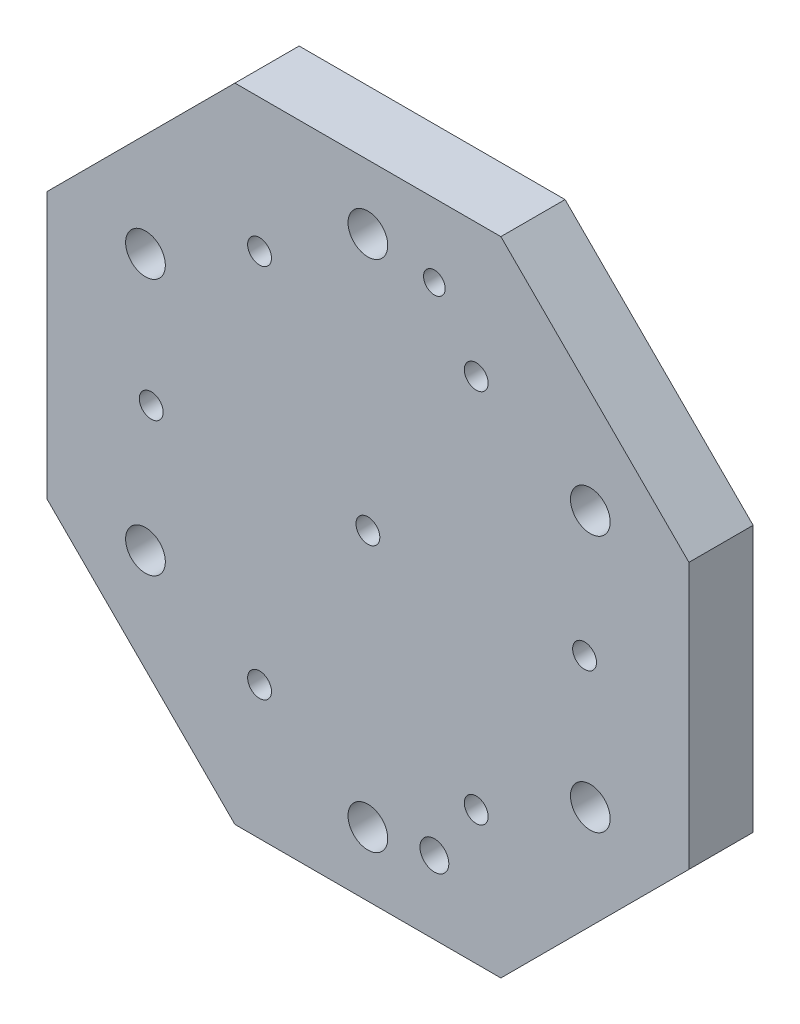
ISO-10303-21;
HEADER;
FILE_DESCRIPTION(('STEP AP214'),'2;1');
FILE_NAME('part.step','',(''),(''),'','','');
FILE_SCHEMA(('AUTOMOTIVE_DESIGN { 1 0 10303 214 1 1 1 1 }'));
ENDSEC;
DATA;
#1=APPLICATION_CONTEXT('core data for automotive mechanical design processes');
#2=APPLICATION_PROTOCOL_DEFINITION('international standard','automotive_design',2000,#1);
#3=PRODUCT_CONTEXT('',#1,'mechanical');
#4=PRODUCT('Part','Part','',(#3));
#5=PRODUCT_RELATED_PRODUCT_CATEGORY('part','',(#4));
#6=PRODUCT_DEFINITION_FORMATION('','',#4);
#7=PRODUCT_DEFINITION_CONTEXT('part definition',#1,'design');
#8=PRODUCT_DEFINITION('design','',#6,#7);
#9=PRODUCT_DEFINITION_SHAPE('','',#8);
#10=(LENGTH_UNIT() NAMED_UNIT(*) SI_UNIT(.MILLI.,.METRE.));
#11=(NAMED_UNIT(*) PLANE_ANGLE_UNIT() SI_UNIT($,.RADIAN.));
#12=(NAMED_UNIT(*) SI_UNIT($,.STERADIAN.) SOLID_ANGLE_UNIT());
#13=UNCERTAINTY_MEASURE_WITH_UNIT(LENGTH_MEASURE(1.E-05),#10,'distance_accuracy_value','');
#14=(GEOMETRIC_REPRESENTATION_CONTEXT(3) GLOBAL_UNCERTAINTY_ASSIGNED_CONTEXT((#13)) GLOBAL_UNIT_ASSIGNED_CONTEXT((#10,
#11,#12)) REPRESENTATION_CONTEXT('',''));
#15=CARTESIAN_POINT('',(0.,0.,0.));
#16=DIRECTION('',(0.,0.,1.));
#17=DIRECTION('',(1.,0.,0.));
#18=AXIS2_PLACEMENT_3D('',#15,#16,#17);
#19=CARTESIAN_POINT('',(0.,0.,0.));
#20=DIRECTION('',(0.,0.,1.));
#21=DIRECTION('',(1.,0.,0.));
#22=AXIS2_PLACEMENT_3D('',#19,#20,#21);
#23=PLANE('',#22);
#24=CARTESIAN_POINT('',(0.,0.,0.));
#25=DIRECTION('',(0.,0.,-1.));
#26=DIRECTION('',(-1.,0.,0.));
#27=AXIS2_PLACEMENT_3D('',#24,#25,#26);
#28=CIRCLE('',#27,1.65);
#29=CARTESIAN_POINT('',(-1.65,0.,0.));
#30=VERTEX_POINT('',#29);
#31=EDGE_CURVE('E273',#30,#30,#28,.T.);
#32=ORIENTED_EDGE('',*,*,#31,.T.);
#33=EDGE_LOOP('',(#32));
#34=FACE_BOUND('',#33,.T.);
#35=CARTESIAN_POINT('',(-30.,0.,0.));
#36=DIRECTION('',(0.,0.,-1.));
#37=DIRECTION('',(-1.,0.,0.));
#38=AXIS2_PLACEMENT_3D('',#35,#36,#37);
#39=CIRCLE('',#38,1.65);
#40=CARTESIAN_POINT('',(-31.65,0.,0.));
#41=VERTEX_POINT('',#40);
#42=EDGE_CURVE('E278',#41,#41,#39,.T.);
#43=ORIENTED_EDGE('',*,*,#42,.T.);
#44=EDGE_LOOP('',(#43));
#45=FACE_BOUND('',#44,.T.);
#46=CARTESIAN_POINT('',(15.,-25.9807621135332,0.));
#47=DIRECTION('',(0.,0.,-1.));
#48=DIRECTION('',(-1.,0.,0.));
#49=AXIS2_PLACEMENT_3D('',#46,#47,#48);
#50=CIRCLE('',#49,1.65);
#51=CARTESIAN_POINT('',(13.35,-25.9807621135332,0.));
#52=VERTEX_POINT('',#51);
#53=EDGE_CURVE('E292',#52,#52,#50,.T.);
#54=ORIENTED_EDGE('',*,*,#53,.T.);
#55=EDGE_LOOP('',(#54));
#56=FACE_BOUND('',#55,.T.);
#57=CARTESIAN_POINT('',(15.,25.9807621135332,0.));
#58=DIRECTION('',(0.,0.,-1.));
#59=DIRECTION('',(-1.,0.,0.));
#60=AXIS2_PLACEMENT_3D('',#57,#58,#59);
#61=CIRCLE('',#60,1.65);
#62=CARTESIAN_POINT('',(13.35,25.9807621135332,0.));
#63=VERTEX_POINT('',#62);
#64=EDGE_CURVE('E300',#63,#63,#61,.T.);
#65=ORIENTED_EDGE('',*,*,#64,.T.);
#66=EDGE_LOOP('',(#65));
#67=FACE_BOUND('',#66,.T.);
#68=CARTESIAN_POINT('',(-15.,25.9807621135332,0.));
#69=DIRECTION('',(0.,0.,-1.));
#70=DIRECTION('',(-1.,0.,0.));
#71=AXIS2_PLACEMENT_3D('',#68,#69,#70);
#72=CIRCLE('',#71,1.65);
#73=CARTESIAN_POINT('',(-16.65,25.9807621135332,0.));
#74=VERTEX_POINT('',#73);
#75=EDGE_CURVE('E308',#74,#74,#72,.T.);
#76=ORIENTED_EDGE('',*,*,#75,.T.);
#77=EDGE_LOOP('',(#76));
#78=FACE_BOUND('',#77,.T.);
#79=CARTESIAN_POINT('',(-15.,-25.9807621135332,0.));
#80=DIRECTION('',(0.,0.,-1.));
#81=DIRECTION('',(-1.,0.,0.));
#82=AXIS2_PLACEMENT_3D('',#79,#80,#81);
#83=CIRCLE('',#82,1.65);
#84=CARTESIAN_POINT('',(-16.65,-25.9807621135332,0.));
#85=VERTEX_POINT('',#84);
#86=EDGE_CURVE('E315',#85,#85,#83,.T.);
#87=ORIENTED_EDGE('',*,*,#86,.T.);
#88=EDGE_LOOP('',(#87));
#89=FACE_BOUND('',#88,.T.);
#90=CARTESIAN_POINT('',(30.,0.,0.));
#91=DIRECTION('',(0.,0.,-1.));
#92=DIRECTION('',(-1.,0.,0.));
#93=AXIS2_PLACEMENT_3D('',#90,#91,#92);
#94=CIRCLE('',#93,1.65);
#95=CARTESIAN_POINT('',(28.35,0.,0.));
#96=VERTEX_POINT('',#95);
#97=EDGE_CURVE('E323',#96,#96,#94,.T.);
#98=ORIENTED_EDGE('',*,*,#97,.T.);
#99=EDGE_LOOP('',(#98));
#100=FACE_BOUND('',#99,.T.);
#101=CARTESIAN_POINT('',(30.7958633585751,17.7800000000003,0.));
#102=DIRECTION('',(0.,0.,-1.));
#103=DIRECTION('',(-1.,0.,0.));
#104=AXIS2_PLACEMENT_3D('',#101,#102,#103);
#105=CIRCLE('',#104,2.75);
#106=CARTESIAN_POINT('',(28.045863358575,17.7800000000003,0.));
#107=VERTEX_POINT('',#106);
#108=EDGE_CURVE('E355',#107,#107,#105,.T.);
#109=ORIENTED_EDGE('',*,*,#108,.T.);
#110=EDGE_LOOP('',(#109));
#111=FACE_BOUND('',#110,.T.);
#112=CARTESIAN_POINT('',(30.7958633585748,-17.7799999999998,0.));
#113=DIRECTION('',(0.,0.,-1.));
#114=DIRECTION('',(-1.,0.,0.));
#115=AXIS2_PLACEMENT_3D('',#112,#113,#114);
#116=CIRCLE('',#115,2.75);
#117=CARTESIAN_POINT('',(28.0458633585748,-17.7799999999998,0.));
#118=VERTEX_POINT('',#117);
#119=EDGE_CURVE('E363',#118,#118,#116,.T.);
#120=ORIENTED_EDGE('',*,*,#119,.T.);
#121=EDGE_LOOP('',(#120));
#122=FACE_BOUND('',#121,.T.);
#123=CARTESIAN_POINT('',(0.,-35.5599999999995,0.));
#124=DIRECTION('',(0.,0.,-1.));
#125=DIRECTION('',(-1.,0.,0.));
#126=AXIS2_PLACEMENT_3D('',#123,#124,#125);
#127=CIRCLE('',#126,2.75);
#128=CARTESIAN_POINT('',(-2.75000000000008,-35.5599999999995,0.));
#129=VERTEX_POINT('',#128);
#130=EDGE_CURVE('E371',#129,#129,#127,.T.);
#131=ORIENTED_EDGE('',*,*,#130,.T.);
#132=EDGE_LOOP('',(#131));
#133=FACE_BOUND('',#132,.T.);
#134=CARTESIAN_POINT('',(-30.7958633585743,-17.7799999999995,0.));
#135=DIRECTION('',(0.,0.,-1.));
#136=DIRECTION('',(-1.,0.,0.));
#137=AXIS2_PLACEMENT_3D('',#134,#135,#136);
#138=CIRCLE('',#137,2.75);
#139=CARTESIAN_POINT('',(-33.5458633585743,-17.7799999999995,0.));
#140=VERTEX_POINT('',#139);
#141=EDGE_CURVE('E379',#140,#140,#138,.T.);
#142=ORIENTED_EDGE('',*,*,#141,.T.);
#143=EDGE_LOOP('',(#142));
#144=FACE_BOUND('',#143,.T.);
#145=DIRECTION('',(0.707106781186548,-0.707106781186547,0.));
#146=VECTOR('',#145,1.);
#147=CARTESIAN_POINT('',(-44.45,-18.4117928474841,0.));
#148=LINE('',#147,#146);
#149=CARTESIAN_POINT('',(-44.45,-18.4117928474841,0.));
#150=VERTEX_POINT('',#149);
#151=CARTESIAN_POINT('',(-18.411792847484,-44.45,0.));
#152=VERTEX_POINT('',#151);
#153=EDGE_CURVE('E142',#150,#152,#148,.T.);
#154=ORIENTED_EDGE('',*,*,#153,.T.);
#155=DIRECTION('',(1.,0.,0.));
#156=VECTOR('',#155,1.);
#157=CARTESIAN_POINT('',(-18.411792847484,-44.45,0.));
#158=LINE('',#157,#156);
#159=CARTESIAN_POINT('',(18.4117928474841,-44.45,0.));
#160=VERTEX_POINT('',#159);
#161=EDGE_CURVE('E146',#152,#160,#158,.T.);
#162=ORIENTED_EDGE('',*,*,#161,.T.);
#163=DIRECTION('',(0.707106781186547,0.707106781186548,0.));
#164=VECTOR('',#163,1.);
#165=CARTESIAN_POINT('',(18.4117928474841,-44.45,0.));
#166=LINE('',#165,#164);
#167=CARTESIAN_POINT('',(44.45,-18.411792847484,0.));
#168=VERTEX_POINT('',#167);
#169=EDGE_CURVE('E151',#160,#168,#166,.T.);
#170=ORIENTED_EDGE('',*,*,#169,.T.);
#171=DIRECTION('',(0.,1.,0.));
#172=VECTOR('',#171,1.);
#173=CARTESIAN_POINT('',(44.45,-18.411792847484,0.));
#174=LINE('',#173,#172);
#175=CARTESIAN_POINT('',(44.45,18.4117928474841,0.));
#176=VERTEX_POINT('',#175);
#177=EDGE_CURVE('E155',#168,#176,#174,.T.);
#178=ORIENTED_EDGE('',*,*,#177,.T.);
#179=DIRECTION('',(-0.707106781186548,0.707106781186547,0.));
#180=VECTOR('',#179,1.);
#181=CARTESIAN_POINT('',(44.45,18.4117928474841,0.));
#182=LINE('',#181,#180);
#183=CARTESIAN_POINT('',(18.4117928474841,44.45,0.));
#184=VERTEX_POINT('',#183);
#185=EDGE_CURVE('E159',#176,#184,#182,.T.);
#186=ORIENTED_EDGE('',*,*,#185,.T.);
#187=DIRECTION('',(-1.,0.,0.));
#188=VECTOR('',#187,1.);
#189=CARTESIAN_POINT('',(18.4117928474841,44.45,0.));
#190=LINE('',#189,#188);
#191=CARTESIAN_POINT('',(-18.4117928474841,44.45,0.));
#192=VERTEX_POINT('',#191);
#193=EDGE_CURVE('E163',#184,#192,#190,.T.);
#194=ORIENTED_EDGE('',*,*,#193,.T.);
#195=DIRECTION('',(-0.707106781186547,-0.707106781186548,0.));
#196=VECTOR('',#195,1.);
#197=CARTESIAN_POINT('',(-18.4117928474841,44.45,0.));
#198=LINE('',#197,#196);
#199=CARTESIAN_POINT('',(-44.45,18.4117928474841,0.));
#200=VERTEX_POINT('',#199);
#201=EDGE_CURVE('E112',#192,#200,#198,.T.);
#202=ORIENTED_EDGE('',*,*,#201,.T.);
#203=DIRECTION('',(0.,-1.,0.));
#204=VECTOR('',#203,1.);
#205=CARTESIAN_POINT('',(-44.45,18.4117928474841,0.));
#206=LINE('',#205,#204);
#207=EDGE_CURVE('E168',#200,#150,#206,.T.);
#208=ORIENTED_EDGE('',*,*,#207,.T.);
#209=EDGE_LOOP('',(#154,#162,#170,#178,#186,#194,#202,#208));
#210=FACE_BOUND('',#209,.T.);
#211=CARTESIAN_POINT('',(-30.7958633585743,17.7800000000005,0.));
#212=DIRECTION('',(0.,0.,-1.));
#213=DIRECTION('',(-1.,0.,0.));
#214=AXIS2_PLACEMENT_3D('',#211,#212,#213);
#215=CIRCLE('',#214,2.75);
#216=CARTESIAN_POINT('',(-33.5458633585743,17.7800000000005,0.));
#217=VERTEX_POINT('',#216);
#218=EDGE_CURVE('E387',#217,#217,#215,.T.);
#219=ORIENTED_EDGE('',*,*,#218,.T.);
#220=EDGE_LOOP('',(#219));
#221=FACE_BOUND('',#220,.T.);
#222=CARTESIAN_POINT('',(4.44089209850063E-13,35.5600000000005,0.));
#223=DIRECTION('',(0.,0.,-1.));
#224=DIRECTION('',(-1.,0.,0.));
#225=AXIS2_PLACEMENT_3D('',#222,#223,#224);
#226=CIRCLE('',#225,2.75);
#227=CARTESIAN_POINT('',(-2.74999999999956,35.5600000000005,0.));
#228=VERTEX_POINT('',#227);
#229=EDGE_CURVE('E347',#228,#228,#226,.T.);
#230=ORIENTED_EDGE('',*,*,#229,.T.);
#231=EDGE_LOOP('',(#230));
#232=FACE_BOUND('',#231,.T.);
#233=CARTESIAN_POINT('',(9.20360524384607,-34.3483223828387,0.));
#234=DIRECTION('',(0.,0.,-1.));
#235=DIRECTION('',(-1.,0.,0.));
#236=AXIS2_PLACEMENT_3D('',#233,#234,#235);
#237=CIRCLE('',#236,2.);
#238=CARTESIAN_POINT('',(7.20360524384607,-34.3483223828387,0.));
#239=VERTEX_POINT('',#238);
#240=EDGE_CURVE('E339',#239,#239,#237,.T.);
#241=ORIENTED_EDGE('',*,*,#240,.T.);
#242=EDGE_LOOP('',(#241));
#243=FACE_BOUND('',#242,.T.);
#244=CARTESIAN_POINT('',(9.2036052438461,34.3483223828397,0.));
#245=DIRECTION('',(0.,0.,-1.));
#246=DIRECTION('',(-1.,0.,0.));
#247=AXIS2_PLACEMENT_3D('',#244,#245,#246);
#248=CIRCLE('',#247,1.5);
#249=CARTESIAN_POINT('',(7.7036052438461,34.3483223828397,0.));
#250=VERTEX_POINT('',#249);
#251=EDGE_CURVE('E331',#250,#250,#248,.T.);
#252=ORIENTED_EDGE('',*,*,#251,.T.);
#253=EDGE_LOOP('',(#252));
#254=FACE_BOUND('',#253,.T.);
#255=ADVANCED_FACE('F36',(#34,#45,#56,#67,#78,#89,#100,#111,#122,#133,#144,#210,#221,#232,#243,
#254),#23,.T.);
#256=CARTESIAN_POINT('',(0.,0.,-8.89));
#257=DIRECTION('',(0.,0.,1.));
#258=DIRECTION('',(1.,0.,0.));
#259=AXIS2_PLACEMENT_3D('',#256,#257,#258);
#260=PLANE('',#259);
#261=CARTESIAN_POINT('',(0.,0.,-8.89));
#262=DIRECTION('',(0.,0.,-1.));
#263=DIRECTION('',(-1.,0.,0.));
#264=AXIS2_PLACEMENT_3D('',#261,#262,#263);
#265=CIRCLE('',#264,1.65);
#266=CARTESIAN_POINT('',(-1.65,0.,-8.89));
#267=VERTEX_POINT('',#266);
#268=EDGE_CURVE('E276',#267,#267,#265,.T.);
#269=ORIENTED_EDGE('',*,*,#268,.F.);
#270=EDGE_LOOP('',(#269));
#271=FACE_BOUND('',#270,.T.);
#272=CARTESIAN_POINT('',(-30.,0.,-8.89));
#273=DIRECTION('',(0.,0.,-1.));
#274=DIRECTION('',(-1.,0.,0.));
#275=AXIS2_PLACEMENT_3D('',#272,#273,#274);
#276=CIRCLE('',#275,1.65);
#277=CARTESIAN_POINT('',(-31.65,0.,-8.89));
#278=VERTEX_POINT('',#277);
#279=EDGE_CURVE('E285',#278,#278,#276,.T.);
#280=ORIENTED_EDGE('',*,*,#279,.F.);
#281=EDGE_LOOP('',(#280));
#282=FACE_BOUND('',#281,.T.);
#283=CARTESIAN_POINT('',(15.,-25.9807621135332,-8.89));
#284=DIRECTION('',(0.,0.,-1.));
#285=DIRECTION('',(-1.,0.,0.));
#286=AXIS2_PLACEMENT_3D('',#283,#284,#285);
#287=CIRCLE('',#286,1.65);
#288=CARTESIAN_POINT('',(13.35,-25.9807621135332,-8.89));
#289=VERTEX_POINT('',#288);
#290=EDGE_CURVE('E296',#289,#289,#287,.T.);
#291=ORIENTED_EDGE('',*,*,#290,.F.);
#292=EDGE_LOOP('',(#291));
#293=FACE_BOUND('',#292,.T.);
#294=CARTESIAN_POINT('',(15.,25.9807621135332,-8.89));
#295=DIRECTION('',(0.,0.,-1.));
#296=DIRECTION('',(-1.,0.,0.));
#297=AXIS2_PLACEMENT_3D('',#294,#295,#296);
#298=CIRCLE('',#297,1.65);
#299=CARTESIAN_POINT('',(13.35,25.9807621135332,-8.89));
#300=VERTEX_POINT('',#299);
#301=EDGE_CURVE('E304',#300,#300,#298,.T.);
#302=ORIENTED_EDGE('',*,*,#301,.F.);
#303=EDGE_LOOP('',(#302));
#304=FACE_BOUND('',#303,.T.);
#305=CARTESIAN_POINT('',(-15.,25.9807621135332,-8.89));
#306=DIRECTION('',(0.,0.,-1.));
#307=DIRECTION('',(-1.,0.,0.));
#308=AXIS2_PLACEMENT_3D('',#305,#306,#307);
#309=CIRCLE('',#308,1.65);
#310=CARTESIAN_POINT('',(-16.65,25.9807621135332,-8.89));
#311=VERTEX_POINT('',#310);
#312=EDGE_CURVE('E311',#311,#311,#309,.T.);
#313=ORIENTED_EDGE('',*,*,#312,.F.);
#314=EDGE_LOOP('',(#313));
#315=FACE_BOUND('',#314,.T.);
#316=CARTESIAN_POINT('',(-15.,-25.9807621135332,-8.89));
#317=DIRECTION('',(0.,0.,-1.));
#318=DIRECTION('',(-1.,0.,0.));
#319=AXIS2_PLACEMENT_3D('',#316,#317,#318);
#320=CIRCLE('',#319,1.65);
#321=CARTESIAN_POINT('',(-16.65,-25.9807621135332,-8.89));
#322=VERTEX_POINT('',#321);
#323=EDGE_CURVE('E319',#322,#322,#320,.T.);
#324=ORIENTED_EDGE('',*,*,#323,.F.);
#325=EDGE_LOOP('',(#324));
#326=FACE_BOUND('',#325,.T.);
#327=CARTESIAN_POINT('',(30.,0.,-8.89));
#328=DIRECTION('',(0.,0.,-1.));
#329=DIRECTION('',(-1.,0.,0.));
#330=AXIS2_PLACEMENT_3D('',#327,#328,#329);
#331=CIRCLE('',#330,1.65);
#332=CARTESIAN_POINT('',(28.35,0.,-8.89));
#333=VERTEX_POINT('',#332);
#334=EDGE_CURVE('E327',#333,#333,#331,.T.);
#335=ORIENTED_EDGE('',*,*,#334,.F.);
#336=EDGE_LOOP('',(#335));
#337=FACE_BOUND('',#336,.T.);
#338=CARTESIAN_POINT('',(9.2036052438461,34.3483223828397,-8.89));
#339=DIRECTION('',(0.,0.,-1.));
#340=DIRECTION('',(-1.,0.,0.));
#341=AXIS2_PLACEMENT_3D('',#338,#339,#340);
#342=CIRCLE('',#341,1.5);
#343=CARTESIAN_POINT('',(7.7036052438461,34.3483223828397,-8.89));
#344=VERTEX_POINT('',#343);
#345=EDGE_CURVE('E335',#344,#344,#342,.T.);
#346=ORIENTED_EDGE('',*,*,#345,.F.);
#347=EDGE_LOOP('',(#346));
#348=FACE_BOUND('',#347,.T.);
#349=CARTESIAN_POINT('',(4.44089209850063E-13,35.5600000000005,-8.89));
#350=DIRECTION('',(0.,0.,-1.));
#351=DIRECTION('',(-1.,0.,0.));
#352=AXIS2_PLACEMENT_3D('',#349,#350,#351);
#353=CIRCLE('',#352,2.75);
#354=CARTESIAN_POINT('',(-2.74999999999956,35.5600000000005,-8.89));
#355=VERTEX_POINT('',#354);
#356=EDGE_CURVE('E351',#355,#355,#353,.T.);
#357=ORIENTED_EDGE('',*,*,#356,.F.);
#358=EDGE_LOOP('',(#357));
#359=FACE_BOUND('',#358,.T.);
#360=CARTESIAN_POINT('',(30.7958633585751,17.7800000000003,-8.89));
#361=DIRECTION('',(0.,0.,-1.));
#362=DIRECTION('',(-1.,0.,0.));
#363=AXIS2_PLACEMENT_3D('',#360,#361,#362);
#364=CIRCLE('',#363,2.75);
#365=CARTESIAN_POINT('',(28.045863358575,17.7800000000003,-8.89));
#366=VERTEX_POINT('',#365);
#367=EDGE_CURVE('E359',#366,#366,#364,.T.);
#368=ORIENTED_EDGE('',*,*,#367,.F.);
#369=EDGE_LOOP('',(#368));
#370=FACE_BOUND('',#369,.T.);
#371=CARTESIAN_POINT('',(30.7958633585748,-17.7799999999998,-8.89));
#372=DIRECTION('',(0.,0.,-1.));
#373=DIRECTION('',(-1.,0.,0.));
#374=AXIS2_PLACEMENT_3D('',#371,#372,#373);
#375=CIRCLE('',#374,2.75);
#376=CARTESIAN_POINT('',(28.0458633585748,-17.7799999999998,-8.89));
#377=VERTEX_POINT('',#376);
#378=EDGE_CURVE('E367',#377,#377,#375,.T.);
#379=ORIENTED_EDGE('',*,*,#378,.F.);
#380=EDGE_LOOP('',(#379));
#381=FACE_BOUND('',#380,.T.);
#382=CARTESIAN_POINT('',(0.,-35.5599999999995,-8.89));
#383=DIRECTION('',(0.,0.,-1.));
#384=DIRECTION('',(-1.,0.,0.));
#385=AXIS2_PLACEMENT_3D('',#382,#383,#384);
#386=CIRCLE('',#385,2.75);
#387=CARTESIAN_POINT('',(-2.75000000000008,-35.5599999999995,-8.89));
#388=VERTEX_POINT('',#387);
#389=EDGE_CURVE('E375',#388,#388,#386,.T.);
#390=ORIENTED_EDGE('',*,*,#389,.F.);
#391=EDGE_LOOP('',(#390));
#392=FACE_BOUND('',#391,.T.);
#393=CARTESIAN_POINT('',(-30.7958633585743,-17.7799999999995,-8.89));
#394=DIRECTION('',(0.,0.,-1.));
#395=DIRECTION('',(-1.,0.,0.));
#396=AXIS2_PLACEMENT_3D('',#393,#394,#395);
#397=CIRCLE('',#396,2.75);
#398=CARTESIAN_POINT('',(-33.5458633585743,-17.7799999999995,-8.89));
#399=VERTEX_POINT('',#398);
#400=EDGE_CURVE('E383',#399,#399,#397,.T.);
#401=ORIENTED_EDGE('',*,*,#400,.F.);
#402=EDGE_LOOP('',(#401));
#403=FACE_BOUND('',#402,.T.);
#404=CARTESIAN_POINT('',(-30.7958633585743,17.7800000000005,-8.89));
#405=DIRECTION('',(0.,0.,-1.));
#406=DIRECTION('',(-1.,0.,0.));
#407=AXIS2_PLACEMENT_3D('',#404,#405,#406);
#408=CIRCLE('',#407,2.75);
#409=CARTESIAN_POINT('',(-33.5458633585743,17.7800000000005,-8.89));
#410=VERTEX_POINT('',#409);
#411=EDGE_CURVE('E147',#410,#410,#408,.T.);
#412=ORIENTED_EDGE('',*,*,#411,.F.);
#413=EDGE_LOOP('',(#412));
#414=FACE_BOUND('',#413,.T.);
#415=DIRECTION('',(0.707106781186548,-0.707106781186547,0.));
#416=VECTOR('',#415,1.);
#417=CARTESIAN_POINT('',(-44.45,-18.4117928474841,-8.89));
#418=LINE('',#417,#416);
#419=CARTESIAN_POINT('',(-44.45,-18.4117928474841,-8.89));
#420=VERTEX_POINT('',#419);
#421=CARTESIAN_POINT('',(-18.411792847484,-44.45,-8.89));
#422=VERTEX_POINT('',#421);
#423=EDGE_CURVE('E171',#420,#422,#418,.T.);
#424=ORIENTED_EDGE('',*,*,#423,.F.);
#425=DIRECTION('',(0.,-1.,0.));
#426=VECTOR('',#425,1.);
#427=CARTESIAN_POINT('',(-44.45,18.4117928474841,-8.89));
#428=LINE('',#427,#426);
#429=CARTESIAN_POINT('',(-44.45,18.4117928474841,-8.89));
#430=VERTEX_POINT('',#429);
#431=EDGE_CURVE('E127',#430,#420,#428,.T.);
#432=ORIENTED_EDGE('',*,*,#431,.F.);
#433=DIRECTION('',(-0.707106781186547,-0.707106781186548,0.));
#434=VECTOR('',#433,1.);
#435=CARTESIAN_POINT('',(-18.4117928474841,44.45,-8.89));
#436=LINE('',#435,#434);
#437=CARTESIAN_POINT('',(-18.4117928474841,44.45,-8.89));
#438=VERTEX_POINT('',#437);
#439=EDGE_CURVE('E110',#438,#430,#436,.T.);
#440=ORIENTED_EDGE('',*,*,#439,.F.);
#441=DIRECTION('',(-1.,0.,0.));
#442=VECTOR('',#441,1.);
#443=CARTESIAN_POINT('',(18.4117928474841,44.45,-8.89));
#444=LINE('',#443,#442);
#445=CARTESIAN_POINT('',(18.4117928474841,44.45,-8.89));
#446=VERTEX_POINT('',#445);
#447=EDGE_CURVE('E125',#446,#438,#444,.T.);
#448=ORIENTED_EDGE('',*,*,#447,.F.);
#449=DIRECTION('',(-0.707106781186548,0.707106781186547,0.));
#450=VECTOR('',#449,1.);
#451=CARTESIAN_POINT('',(44.45,18.4117928474841,-8.89));
#452=LINE('',#451,#450);
#453=CARTESIAN_POINT('',(44.45,18.4117928474841,-8.89));
#454=VERTEX_POINT('',#453);
#455=EDGE_CURVE('E132',#454,#446,#452,.T.);
#456=ORIENTED_EDGE('',*,*,#455,.F.);
#457=DIRECTION('',(0.,1.,0.));
#458=VECTOR('',#457,1.);
#459=CARTESIAN_POINT('',(44.45,-18.411792847484,-8.89));
#460=LINE('',#459,#458);
#461=CARTESIAN_POINT('',(44.45,-18.411792847484,-8.89));
#462=VERTEX_POINT('',#461);
#463=EDGE_CURVE('E136',#462,#454,#460,.T.);
#464=ORIENTED_EDGE('',*,*,#463,.F.);
#465=DIRECTION('',(0.707106781186547,0.707106781186548,0.));
#466=VECTOR('',#465,1.);
#467=CARTESIAN_POINT('',(18.4117928474841,-44.45,-8.89));
#468=LINE('',#467,#466);
#469=CARTESIAN_POINT('',(18.4117928474841,-44.45,-8.89));
#470=VERTEX_POINT('',#469);
#471=EDGE_CURVE('E399',#470,#462,#468,.T.);
#472=ORIENTED_EDGE('',*,*,#471,.F.);
#473=DIRECTION('',(1.,0.,0.));
#474=VECTOR('',#473,1.);
#475=CARTESIAN_POINT('',(-18.411792847484,-44.45,-8.89));
#476=LINE('',#475,#474);
#477=EDGE_CURVE('E396',#422,#470,#476,.T.);
#478=ORIENTED_EDGE('',*,*,#477,.F.);
#479=EDGE_LOOP('',(#424,#432,#440,#448,#456,#464,#472,#478));
#480=FACE_BOUND('',#479,.T.);
#481=CARTESIAN_POINT('',(9.20360524384607,-34.3483223828387,-8.89));
#482=DIRECTION('',(0.,0.,-1.));
#483=DIRECTION('',(-1.,0.,0.));
#484=AXIS2_PLACEMENT_3D('',#481,#482,#483);
#485=CIRCLE('',#484,2.);
#486=CARTESIAN_POINT('',(7.20360524384607,-34.3483223828387,-8.89));
#487=VERTEX_POINT('',#486);
#488=EDGE_CURVE('E343',#487,#487,#485,.T.);
#489=ORIENTED_EDGE('',*,*,#488,.F.);
#490=EDGE_LOOP('',(#489));
#491=FACE_BOUND('',#490,.T.);
#492=ADVANCED_FACE('F122',(#271,#282,#293,#304,#315,#326,#337,#348,#359,#370,#381,#392,#403,
#414,#480,#491),#260,.F.);
#493=CARTESIAN_POINT('',(-44.45,-18.4117928474841,-8.89));
#494=DIRECTION('',(-0.707106781186547,-0.707106781186548,0.));
#495=DIRECTION('',(0.707106781186548,-0.707106781186547,0.));
#496=AXIS2_PLACEMENT_3D('',#493,#494,#495);
#497=PLANE('',#496);
#498=ORIENTED_EDGE('',*,*,#153,.F.);
#499=DIRECTION('',(0.,0.,1.));
#500=VECTOR('',#499,1.);
#501=CARTESIAN_POINT('',(-44.45,-18.4117928474841,-8.89));
#502=LINE('',#501,#500);
#503=EDGE_CURVE('E11',#420,#150,#502,.T.);
#504=ORIENTED_EDGE('',*,*,#503,.F.);
#505=ORIENTED_EDGE('',*,*,#423,.T.);
#506=DIRECTION('',(0.,0.,1.));
#507=VECTOR('',#506,1.);
#508=CARTESIAN_POINT('',(-18.411792847484,-44.45,-8.89));
#509=LINE('',#508,#507);
#510=EDGE_CURVE('E40',#422,#152,#509,.T.);
#511=ORIENTED_EDGE('',*,*,#510,.T.);
#512=EDGE_LOOP('',(#498,#504,#505,#511));
#513=FACE_BOUND('',#512,.T.);
#514=ADVANCED_FACE('F38',(#513),#497,.T.);
#515=CARTESIAN_POINT('',(-44.45,18.4117928474841,-8.89));
#516=DIRECTION('',(-1.,0.,0.));
#517=DIRECTION('',(0.,-1.,0.));
#518=AXIS2_PLACEMENT_3D('',#515,#516,#517);
#519=PLANE('',#518);
#520=ORIENTED_EDGE('',*,*,#207,.F.);
#521=DIRECTION('',(0.,0.,1.));
#522=VECTOR('',#521,1.);
#523=CARTESIAN_POINT('',(-44.45,18.4117928474841,-8.89));
#524=LINE('',#523,#522);
#525=EDGE_CURVE('E47',#430,#200,#524,.T.);
#526=ORIENTED_EDGE('',*,*,#525,.F.);
#527=ORIENTED_EDGE('',*,*,#431,.T.);
#528=ORIENTED_EDGE('',*,*,#503,.T.);
#529=EDGE_LOOP('',(#520,#526,#527,#528));
#530=FACE_BOUND('',#529,.T.);
#531=ADVANCED_FACE('F191',(#530),#519,.T.);
#532=CARTESIAN_POINT('',(-18.4117928474841,44.45,-8.89));
#533=DIRECTION('',(-0.707106781186548,0.707106781186547,0.));
#534=DIRECTION('',(-0.707106781186547,-0.707106781186548,0.));
#535=AXIS2_PLACEMENT_3D('',#532,#533,#534);
#536=PLANE('',#535);
#537=ORIENTED_EDGE('',*,*,#201,.F.);
#538=DIRECTION('',(0.,0.,1.));
#539=VECTOR('',#538,1.);
#540=CARTESIAN_POINT('',(-18.4117928474841,44.45,-8.89));
#541=LINE('',#540,#539);
#542=EDGE_CURVE('E107',#438,#192,#541,.T.);
#543=ORIENTED_EDGE('',*,*,#542,.F.);
#544=ORIENTED_EDGE('',*,*,#439,.T.);
#545=ORIENTED_EDGE('',*,*,#525,.T.);
#546=EDGE_LOOP('',(#537,#543,#544,#545));
#547=FACE_BOUND('',#546,.T.);
#548=ADVANCED_FACE('F109',(#547),#536,.T.);
#549=CARTESIAN_POINT('',(18.4117928474841,44.45,-8.89));
#550=DIRECTION('',(0.,1.,0.));
#551=DIRECTION('',(0.,0.,1.));
#552=AXIS2_PLACEMENT_3D('',#549,#550,#551);
#553=PLANE('',#552);
#554=ORIENTED_EDGE('',*,*,#193,.F.);
#555=DIRECTION('',(0.,0.,1.));
#556=VECTOR('',#555,1.);
#557=CARTESIAN_POINT('',(18.4117928474841,44.45,-8.89));
#558=LINE('',#557,#556);
#559=EDGE_CURVE('E118',#446,#184,#558,.T.);
#560=ORIENTED_EDGE('',*,*,#559,.F.);
#561=ORIENTED_EDGE('',*,*,#447,.T.);
#562=ORIENTED_EDGE('',*,*,#542,.T.);
#563=EDGE_LOOP('',(#554,#560,#561,#562));
#564=FACE_BOUND('',#563,.T.);
#565=ADVANCED_FACE('F130',(#564),#553,.T.);
#566=CARTESIAN_POINT('',(44.45,18.4117928474841,-8.89));
#567=DIRECTION('',(0.707106781186547,0.707106781186548,0.));
#568=DIRECTION('',(-0.707106781186548,0.707106781186547,0.));
#569=AXIS2_PLACEMENT_3D('',#566,#567,#568);
#570=PLANE('',#569);
#571=ORIENTED_EDGE('',*,*,#185,.F.);
#572=DIRECTION('',(0.,0.,1.));
#573=VECTOR('',#572,1.);
#574=CARTESIAN_POINT('',(44.45,18.4117928474841,-8.89));
#575=LINE('',#574,#573);
#576=EDGE_CURVE('E177',#454,#176,#575,.T.);
#577=ORIENTED_EDGE('',*,*,#576,.F.);
#578=ORIENTED_EDGE('',*,*,#455,.T.);
#579=ORIENTED_EDGE('',*,*,#559,.T.);
#580=EDGE_LOOP('',(#571,#577,#578,#579));
#581=FACE_BOUND('',#580,.T.);
#582=ADVANCED_FACE('F414',(#581),#570,.T.);
#583=CARTESIAN_POINT('',(44.45,-18.411792847484,-8.89));
#584=DIRECTION('',(1.,0.,0.));
#585=DIRECTION('',(0.,1.,0.));
#586=AXIS2_PLACEMENT_3D('',#583,#584,#585);
#587=PLANE('',#586);
#588=ORIENTED_EDGE('',*,*,#177,.F.);
#589=DIRECTION('',(0.,0.,1.));
#590=VECTOR('',#589,1.);
#591=CARTESIAN_POINT('',(44.45,-18.411792847484,-8.89));
#592=LINE('',#591,#590);
#593=EDGE_CURVE('E180',#462,#168,#592,.T.);
#594=ORIENTED_EDGE('',*,*,#593,.F.);
#595=ORIENTED_EDGE('',*,*,#463,.T.);
#596=ORIENTED_EDGE('',*,*,#576,.T.);
#597=EDGE_LOOP('',(#588,#594,#595,#596));
#598=FACE_BOUND('',#597,.T.);
#599=ADVANCED_FACE('F408',(#598),#587,.T.);
#600=CARTESIAN_POINT('',(18.4117928474841,-44.45,-8.89));
#601=DIRECTION('',(0.707106781186548,-0.707106781186547,0.));
#602=DIRECTION('',(0.707106781186547,0.707106781186548,0.));
#603=AXIS2_PLACEMENT_3D('',#600,#601,#602);
#604=PLANE('',#603);
#605=ORIENTED_EDGE('',*,*,#169,.F.);
#606=DIRECTION('',(0.,0.,1.));
#607=VECTOR('',#606,1.);
#608=CARTESIAN_POINT('',(18.4117928474841,-44.45,-8.89));
#609=LINE('',#608,#607);
#610=EDGE_CURVE('E182',#470,#160,#609,.T.);
#611=ORIENTED_EDGE('',*,*,#610,.F.);
#612=ORIENTED_EDGE('',*,*,#471,.T.);
#613=ORIENTED_EDGE('',*,*,#593,.T.);
#614=EDGE_LOOP('',(#605,#611,#612,#613));
#615=FACE_BOUND('',#614,.T.);
#616=ADVANCED_FACE('F412',(#615),#604,.T.);
#617=CARTESIAN_POINT('',(-18.411792847484,-44.45,-8.89));
#618=DIRECTION('',(0.,-1.,0.));
#619=DIRECTION('',(0.,0.,-1.));
#620=AXIS2_PLACEMENT_3D('',#617,#618,#619);
#621=PLANE('',#620);
#622=ORIENTED_EDGE('',*,*,#161,.F.);
#623=ORIENTED_EDGE('',*,*,#510,.F.);
#624=ORIENTED_EDGE('',*,*,#477,.T.);
#625=ORIENTED_EDGE('',*,*,#610,.T.);
#626=EDGE_LOOP('',(#622,#623,#624,#625));
#627=FACE_BOUND('',#626,.T.);
#628=ADVANCED_FACE('F188',(#627),#621,.T.);
#629=CARTESIAN_POINT('',(-30.7958633585743,17.7800000000005,-8.89));
#630=DIRECTION('',(0.,0.,-1.));
#631=DIRECTION('',(-1.,0.,0.));
#632=AXIS2_PLACEMENT_3D('',#629,#630,#631);
#633=CYLINDRICAL_SURFACE('',#632,2.75);
#634=ORIENTED_EDGE('',*,*,#218,.F.);
#635=EDGE_LOOP('',(#634));
#636=FACE_BOUND('',#635,.T.);
#637=ORIENTED_EDGE('',*,*,#411,.T.);
#638=EDGE_LOOP('',(#637));
#639=FACE_BOUND('',#638,.T.);
#640=ADVANCED_FACE('F210',(#636,#639),#633,.F.);
#641=CARTESIAN_POINT('',(-30.7958633585743,-17.7799999999995,-8.89));
#642=DIRECTION('',(0.,0.,-1.));
#643=DIRECTION('',(-1.,0.,0.));
#644=AXIS2_PLACEMENT_3D('',#641,#642,#643);
#645=CYLINDRICAL_SURFACE('',#644,2.75);
#646=ORIENTED_EDGE('',*,*,#141,.F.);
#647=EDGE_LOOP('',(#646));
#648=FACE_BOUND('',#647,.T.);
#649=ORIENTED_EDGE('',*,*,#400,.T.);
#650=EDGE_LOOP('',(#649));
#651=FACE_BOUND('',#650,.T.);
#652=ADVANCED_FACE('F213',(#648,#651),#645,.F.);
#653=CARTESIAN_POINT('',(0.,-35.5599999999995,-8.89));
#654=DIRECTION('',(0.,0.,-1.));
#655=DIRECTION('',(-1.,0.,0.));
#656=AXIS2_PLACEMENT_3D('',#653,#654,#655);
#657=CYLINDRICAL_SURFACE('',#656,2.75);
#658=ORIENTED_EDGE('',*,*,#130,.F.);
#659=EDGE_LOOP('',(#658));
#660=FACE_BOUND('',#659,.T.);
#661=ORIENTED_EDGE('',*,*,#389,.T.);
#662=EDGE_LOOP('',(#661));
#663=FACE_BOUND('',#662,.T.);
#664=ADVANCED_FACE('F217',(#660,#663),#657,.F.);
#665=CARTESIAN_POINT('',(30.7958633585748,-17.7799999999998,-8.89));
#666=DIRECTION('',(0.,0.,-1.));
#667=DIRECTION('',(-1.,0.,0.));
#668=AXIS2_PLACEMENT_3D('',#665,#666,#667);
#669=CYLINDRICAL_SURFACE('',#668,2.75);
#670=ORIENTED_EDGE('',*,*,#119,.F.);
#671=EDGE_LOOP('',(#670));
#672=FACE_BOUND('',#671,.T.);
#673=ORIENTED_EDGE('',*,*,#378,.T.);
#674=EDGE_LOOP('',(#673));
#675=FACE_BOUND('',#674,.T.);
#676=ADVANCED_FACE('F221',(#672,#675),#669,.F.);
#677=CARTESIAN_POINT('',(30.7958633585751,17.7800000000003,-8.89));
#678=DIRECTION('',(0.,0.,-1.));
#679=DIRECTION('',(-1.,0.,0.));
#680=AXIS2_PLACEMENT_3D('',#677,#678,#679);
#681=CYLINDRICAL_SURFACE('',#680,2.75);
#682=ORIENTED_EDGE('',*,*,#108,.F.);
#683=EDGE_LOOP('',(#682));
#684=FACE_BOUND('',#683,.T.);
#685=ORIENTED_EDGE('',*,*,#367,.T.);
#686=EDGE_LOOP('',(#685));
#687=FACE_BOUND('',#686,.T.);
#688=ADVANCED_FACE('F225',(#684,#687),#681,.F.);
#689=CARTESIAN_POINT('',(4.44089209850063E-13,35.5600000000005,-8.89));
#690=DIRECTION('',(0.,0.,-1.));
#691=DIRECTION('',(-1.,0.,0.));
#692=AXIS2_PLACEMENT_3D('',#689,#690,#691);
#693=CYLINDRICAL_SURFACE('',#692,2.75);
#694=ORIENTED_EDGE('',*,*,#229,.F.);
#695=EDGE_LOOP('',(#694));
#696=FACE_BOUND('',#695,.T.);
#697=ORIENTED_EDGE('',*,*,#356,.T.);
#698=EDGE_LOOP('',(#697));
#699=FACE_BOUND('',#698,.T.);
#700=ADVANCED_FACE('F229',(#696,#699),#693,.F.);
#701=CARTESIAN_POINT('',(9.20360524384607,-34.3483223828387,-8.89));
#702=DIRECTION('',(0.,0.,-1.));
#703=DIRECTION('',(-1.,0.,0.));
#704=AXIS2_PLACEMENT_3D('',#701,#702,#703);
#705=CYLINDRICAL_SURFACE('',#704,2.);
#706=ORIENTED_EDGE('',*,*,#240,.F.);
#707=EDGE_LOOP('',(#706));
#708=FACE_BOUND('',#707,.T.);
#709=ORIENTED_EDGE('',*,*,#488,.T.);
#710=EDGE_LOOP('',(#709));
#711=FACE_BOUND('',#710,.T.);
#712=ADVANCED_FACE('F233',(#708,#711),#705,.F.);
#713=CARTESIAN_POINT('',(9.2036052438461,34.3483223828397,-8.89));
#714=DIRECTION('',(0.,0.,-1.));
#715=DIRECTION('',(-1.,0.,0.));
#716=AXIS2_PLACEMENT_3D('',#713,#714,#715);
#717=CYLINDRICAL_SURFACE('',#716,1.5);
#718=ORIENTED_EDGE('',*,*,#251,.F.);
#719=EDGE_LOOP('',(#718));
#720=FACE_BOUND('',#719,.T.);
#721=ORIENTED_EDGE('',*,*,#345,.T.);
#722=EDGE_LOOP('',(#721));
#723=FACE_BOUND('',#722,.T.);
#724=ADVANCED_FACE('F237',(#720,#723),#717,.F.);
#725=CARTESIAN_POINT('',(30.,0.,-8.89));
#726=DIRECTION('',(0.,0.,-1.));
#727=DIRECTION('',(-1.,0.,0.));
#728=AXIS2_PLACEMENT_3D('',#725,#726,#727);
#729=CYLINDRICAL_SURFACE('',#728,1.65);
#730=ORIENTED_EDGE('',*,*,#97,.F.);
#731=EDGE_LOOP('',(#730));
#732=FACE_BOUND('',#731,.T.);
#733=ORIENTED_EDGE('',*,*,#334,.T.);
#734=EDGE_LOOP('',(#733));
#735=FACE_BOUND('',#734,.T.);
#736=ADVANCED_FACE('F241',(#732,#735),#729,.F.);
#737=CARTESIAN_POINT('',(-15.,-25.9807621135332,-8.89));
#738=DIRECTION('',(0.,0.,-1.));
#739=DIRECTION('',(-1.,0.,0.));
#740=AXIS2_PLACEMENT_3D('',#737,#738,#739);
#741=CYLINDRICAL_SURFACE('',#740,1.65);
#742=ORIENTED_EDGE('',*,*,#86,.F.);
#743=EDGE_LOOP('',(#742));
#744=FACE_BOUND('',#743,.T.);
#745=ORIENTED_EDGE('',*,*,#323,.T.);
#746=EDGE_LOOP('',(#745));
#747=FACE_BOUND('',#746,.T.);
#748=ADVANCED_FACE('F245',(#744,#747),#741,.F.);
#749=CARTESIAN_POINT('',(-15.,25.9807621135332,-8.89));
#750=DIRECTION('',(0.,0.,-1.));
#751=DIRECTION('',(-1.,0.,0.));
#752=AXIS2_PLACEMENT_3D('',#749,#750,#751);
#753=CYLINDRICAL_SURFACE('',#752,1.65);
#754=ORIENTED_EDGE('',*,*,#75,.F.);
#755=EDGE_LOOP('',(#754));
#756=FACE_BOUND('',#755,.T.);
#757=ORIENTED_EDGE('',*,*,#312,.T.);
#758=EDGE_LOOP('',(#757));
#759=FACE_BOUND('',#758,.T.);
#760=ADVANCED_FACE('F249',(#756,#759),#753,.F.);
#761=CARTESIAN_POINT('',(15.,25.9807621135332,-8.89));
#762=DIRECTION('',(0.,0.,-1.));
#763=DIRECTION('',(-1.,0.,0.));
#764=AXIS2_PLACEMENT_3D('',#761,#762,#763);
#765=CYLINDRICAL_SURFACE('',#764,1.65);
#766=ORIENTED_EDGE('',*,*,#64,.F.);
#767=EDGE_LOOP('',(#766));
#768=FACE_BOUND('',#767,.T.);
#769=ORIENTED_EDGE('',*,*,#301,.T.);
#770=EDGE_LOOP('',(#769));
#771=FACE_BOUND('',#770,.T.);
#772=ADVANCED_FACE('F253',(#768,#771),#765,.F.);
#773=CARTESIAN_POINT('',(15.,-25.9807621135332,-8.89));
#774=DIRECTION('',(0.,0.,-1.));
#775=DIRECTION('',(-1.,0.,0.));
#776=AXIS2_PLACEMENT_3D('',#773,#774,#775);
#777=CYLINDRICAL_SURFACE('',#776,1.65);
#778=ORIENTED_EDGE('',*,*,#53,.F.);
#779=EDGE_LOOP('',(#778));
#780=FACE_BOUND('',#779,.T.);
#781=ORIENTED_EDGE('',*,*,#290,.T.);
#782=EDGE_LOOP('',(#781));
#783=FACE_BOUND('',#782,.T.);
#784=ADVANCED_FACE('F257',(#780,#783),#777,.F.);
#785=CARTESIAN_POINT('',(-30.,0.,-8.89));
#786=DIRECTION('',(0.,0.,-1.));
#787=DIRECTION('',(-1.,0.,0.));
#788=AXIS2_PLACEMENT_3D('',#785,#786,#787);
#789=CYLINDRICAL_SURFACE('',#788,1.65);
#790=ORIENTED_EDGE('',*,*,#42,.F.);
#791=EDGE_LOOP('',(#790));
#792=FACE_BOUND('',#791,.T.);
#793=ORIENTED_EDGE('',*,*,#279,.T.);
#794=EDGE_LOOP('',(#793));
#795=FACE_BOUND('',#794,.T.);
#796=ADVANCED_FACE('F261',(#792,#795),#789,.F.);
#797=CARTESIAN_POINT('',(0.,0.,-8.89));
#798=DIRECTION('',(0.,0.,-1.));
#799=DIRECTION('',(-1.,0.,0.));
#800=AXIS2_PLACEMENT_3D('',#797,#798,#799);
#801=CYLINDRICAL_SURFACE('',#800,1.65);
#802=ORIENTED_EDGE('',*,*,#31,.F.);
#803=EDGE_LOOP('',(#802));
#804=FACE_BOUND('',#803,.T.);
#805=ORIENTED_EDGE('',*,*,#268,.T.);
#806=EDGE_LOOP('',(#805));
#807=FACE_BOUND('',#806,.T.);
#808=ADVANCED_FACE('F265',(#804,#807),#801,.F.);
#809=CLOSED_SHELL('',(#255,#492,#514,#531,#548,#565,#582,#599,#616,#628,#640,#652,#664,#676,
#688,#700,#712,#724,#736,#748,#760,#772,#784,#796,#808));
#810=MANIFOLD_SOLID_BREP('B2',#809);
#811=ADVANCED_BREP_SHAPE_REPRESENTATION('',(#18,#810),#14);
#812=SHAPE_DEFINITION_REPRESENTATION(#9,#811);
ENDSEC;
END-ISO-10303-21;
